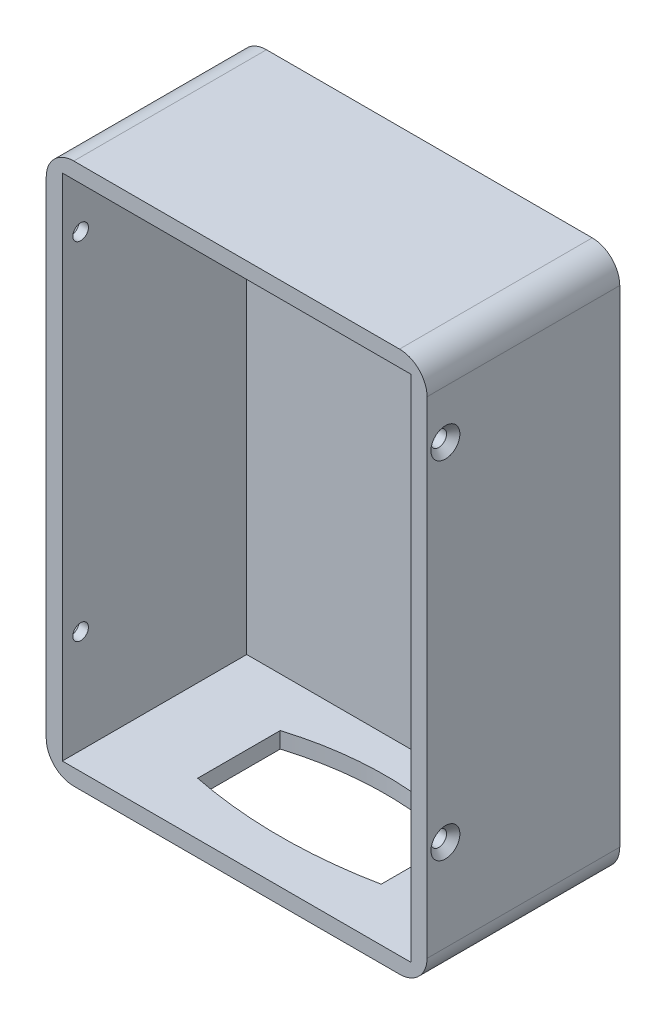
ISO-10303-21;
HEADER;
FILE_DESCRIPTION(('STEP AP214'),'2;1');
FILE_NAME('part.step','',(''),(''),'','','');
FILE_SCHEMA(('AUTOMOTIVE_DESIGN { 1 0 10303 214 1 1 1 1 }'));
ENDSEC;
DATA;
#1=APPLICATION_CONTEXT('core data for automotive mechanical design processes');
#2=APPLICATION_PROTOCOL_DEFINITION('international standard','automotive_design',2000,#1);
#3=PRODUCT_CONTEXT('',#1,'mechanical');
#4=PRODUCT('Part','Part','',(#3));
#5=PRODUCT_RELATED_PRODUCT_CATEGORY('part','',(#4));
#6=PRODUCT_DEFINITION_FORMATION('','',#4);
#7=PRODUCT_DEFINITION_CONTEXT('part definition',#1,'design');
#8=PRODUCT_DEFINITION('design','',#6,#7);
#9=PRODUCT_DEFINITION_SHAPE('','',#8);
#10=(LENGTH_UNIT() NAMED_UNIT(*) SI_UNIT(.MILLI.,.METRE.));
#11=(NAMED_UNIT(*) PLANE_ANGLE_UNIT() SI_UNIT($,.RADIAN.));
#12=(NAMED_UNIT(*) SI_UNIT($,.STERADIAN.) SOLID_ANGLE_UNIT());
#13=UNCERTAINTY_MEASURE_WITH_UNIT(LENGTH_MEASURE(1.E-05),#10,'distance_accuracy_value','');
#14=(GEOMETRIC_REPRESENTATION_CONTEXT(3) GLOBAL_UNCERTAINTY_ASSIGNED_CONTEXT((#13)) GLOBAL_UNIT_ASSIGNED_CONTEXT((#10,
#11,#12)) REPRESENTATION_CONTEXT('',''));
#15=CARTESIAN_POINT('',(0.,0.,0.));
#16=DIRECTION('',(0.,0.,1.));
#17=DIRECTION('',(1.,0.,0.));
#18=AXIS2_PLACEMENT_3D('',#15,#16,#17);
#19=CARTESIAN_POINT('',(41.5,53.,42.));
#20=DIRECTION('',(-1.,0.,0.));
#21=DIRECTION('',(0.,-1.,0.));
#22=AXIS2_PLACEMENT_3D('',#19,#20,#21);
#23=PLANE('',#22);
#24=CARTESIAN_POINT('',(41.5,42.4,38.));
#25=DIRECTION('',(1.,0.,0.));
#26=DIRECTION('',(0.,0.,-1.));
#27=AXIS2_PLACEMENT_3D('',#24,#25,#26);
#28=CIRCLE('',#27,3.15);
#29=CARTESIAN_POINT('',(41.5,42.4,34.85));
#30=VERTEX_POINT('',#29);
#31=EDGE_CURVE('E408',#30,#30,#28,.T.);
#32=ORIENTED_EDGE('',*,*,#31,.F.);
#33=EDGE_LOOP('',(#32));
#34=FACE_BOUND('',#33,.T.);
#35=DIRECTION('',(0.,1.,0.));
#36=VECTOR('',#35,1.);
#37=CARTESIAN_POINT('',(41.5,53.,0.));
#38=LINE('',#37,#36);
#39=CARTESIAN_POINT('',(41.5,-53.,0.));
#40=VERTEX_POINT('',#39);
#41=CARTESIAN_POINT('',(41.5,53.,0.));
#42=VERTEX_POINT('',#41);
#43=EDGE_CURVE('E242',#40,#42,#38,.T.);
#44=ORIENTED_EDGE('',*,*,#43,.T.);
#45=DIRECTION('',(0.,0.,-1.));
#46=VECTOR('',#45,1.);
#47=CARTESIAN_POINT('',(41.5,53.,42.));
#48=LINE('',#47,#46);
#49=CARTESIAN_POINT('',(41.5,53.,42.));
#50=VERTEX_POINT('',#49);
#51=EDGE_CURVE('E262',#50,#42,#48,.T.);
#52=ORIENTED_EDGE('',*,*,#51,.F.);
#53=DIRECTION('',(0.,1.,0.));
#54=VECTOR('',#53,1.);
#55=CARTESIAN_POINT('',(41.5,53.,42.));
#56=LINE('',#55,#54);
#57=CARTESIAN_POINT('',(41.5,-53.,42.));
#58=VERTEX_POINT('',#57);
#59=EDGE_CURVE('E225',#58,#50,#56,.T.);
#60=ORIENTED_EDGE('',*,*,#59,.F.);
#61=DIRECTION('',(0.,0.,-1.));
#62=VECTOR('',#61,1.);
#63=CARTESIAN_POINT('',(41.5,-53.,42.));
#64=LINE('',#63,#62);
#65=EDGE_CURVE('E265',#58,#40,#64,.T.);
#66=ORIENTED_EDGE('',*,*,#65,.T.);
#67=EDGE_LOOP('',(#44,#52,#60,#66));
#68=FACE_BOUND('',#67,.T.);
#69=CARTESIAN_POINT('',(41.5,-33.09,38.));
#70=DIRECTION('',(1.,0.,0.));
#71=DIRECTION('',(0.,0.,-1.));
#72=AXIS2_PLACEMENT_3D('',#69,#70,#71);
#73=CIRCLE('',#72,3.15);
#74=CARTESIAN_POINT('',(41.5,-33.09,34.85));
#75=VERTEX_POINT('',#74);
#76=EDGE_CURVE('E399',#75,#75,#73,.T.);
#77=ORIENTED_EDGE('',*,*,#76,.F.);
#78=EDGE_LOOP('',(#77));
#79=FACE_BOUND('',#78,.T.);
#80=ADVANCED_FACE('F33',(#34,#68,#79),#23,.F.);
#81=CARTESIAN_POINT('',(-35.5,-53.,42.));
#82=DIRECTION('',(0.,0.,1.));
#83=DIRECTION('',(1.,0.,0.));
#84=AXIS2_PLACEMENT_3D('',#81,#82,#83);
#85=PLANE('',#84);
#86=CARTESIAN_POINT('',(-35.5,-53.,42.));
#87=DIRECTION('',(0.,0.,1.));
#88=DIRECTION('',(1.,0.,0.));
#89=AXIS2_PLACEMENT_3D('',#86,#87,#88);
#90=CIRCLE('',#89,6.);
#91=CARTESIAN_POINT('',(-41.5,-53.,42.));
#92=VERTEX_POINT('',#91);
#93=CARTESIAN_POINT('',(-35.5,-59.,42.));
#94=VERTEX_POINT('',#93);
#95=EDGE_CURVE('E217',#92,#94,#90,.T.);
#96=ORIENTED_EDGE('',*,*,#95,.T.);
#97=DIRECTION('',(1.,0.,0.));
#98=VECTOR('',#97,1.);
#99=CARTESIAN_POINT('',(-35.5,-59.,42.));
#100=LINE('',#99,#98);
#101=CARTESIAN_POINT('',(35.5,-59.,42.));
#102=VERTEX_POINT('',#101);
#103=EDGE_CURVE('E220',#94,#102,#100,.T.);
#104=ORIENTED_EDGE('',*,*,#103,.T.);
#105=CARTESIAN_POINT('',(35.5,-53.,42.));
#106=DIRECTION('',(0.,0.,1.));
#107=DIRECTION('',(1.,0.,0.));
#108=AXIS2_PLACEMENT_3D('',#105,#106,#107);
#109=CIRCLE('',#108,6.);
#110=EDGE_CURVE('E223',#102,#58,#109,.T.);
#111=ORIENTED_EDGE('',*,*,#110,.T.);
#112=ORIENTED_EDGE('',*,*,#59,.T.);
#113=CARTESIAN_POINT('',(35.5,53.,42.));
#114=DIRECTION('',(0.,0.,1.));
#115=DIRECTION('',(1.,0.,0.));
#116=AXIS2_PLACEMENT_3D('',#113,#114,#115);
#117=CIRCLE('',#116,6.);
#118=CARTESIAN_POINT('',(35.4999999999999,59.,42.));
#119=VERTEX_POINT('',#118);
#120=EDGE_CURVE('E227',#50,#119,#117,.T.);
#121=ORIENTED_EDGE('',*,*,#120,.T.);
#122=DIRECTION('',(-1.,0.,0.));
#123=VECTOR('',#122,1.);
#124=CARTESIAN_POINT('',(-35.5,59.,42.));
#125=LINE('',#124,#123);
#126=CARTESIAN_POINT('',(-35.5,59.,42.));
#127=VERTEX_POINT('',#126);
#128=EDGE_CURVE('E229',#119,#127,#125,.T.);
#129=ORIENTED_EDGE('',*,*,#128,.T.);
#130=CARTESIAN_POINT('',(-35.5,53.,42.));
#131=DIRECTION('',(0.,0.,1.));
#132=DIRECTION('',(-1.,0.,0.));
#133=AXIS2_PLACEMENT_3D('',#130,#131,#132);
#134=CIRCLE('',#133,6.);
#135=CARTESIAN_POINT('',(-41.5,53.,42.));
#136=VERTEX_POINT('',#135);
#137=EDGE_CURVE('E231',#127,#136,#134,.T.);
#138=ORIENTED_EDGE('',*,*,#137,.T.);
#139=DIRECTION('',(0.,-1.,0.));
#140=VECTOR('',#139,1.);
#141=CARTESIAN_POINT('',(-41.5,53.,42.));
#142=LINE('',#141,#140);
#143=EDGE_CURVE('E233',#136,#92,#142,.T.);
#144=ORIENTED_EDGE('',*,*,#143,.T.);
#145=EDGE_LOOP('',(#96,#104,#111,#112,#121,#129,#138,#144));
#146=FACE_BOUND('',#145,.T.);
#147=DIRECTION('',(-1.,0.,0.));
#148=VECTOR('',#147,1.);
#149=CARTESIAN_POINT('',(-38.,55.5,42.));
#150=LINE('',#149,#148);
#151=CARTESIAN_POINT('',(38.,55.5,42.));
#152=VERTEX_POINT('',#151);
#153=CARTESIAN_POINT('',(-38.,55.5,42.));
#154=VERTEX_POINT('',#153);
#155=EDGE_CURVE('E198',#152,#154,#150,.T.);
#156=ORIENTED_EDGE('',*,*,#155,.F.);
#157=DIRECTION('',(0.,1.,0.));
#158=VECTOR('',#157,1.);
#159=CARTESIAN_POINT('',(38.,55.5,42.));
#160=LINE('',#159,#158);
#161=CARTESIAN_POINT('',(38.,-55.5,42.));
#162=VERTEX_POINT('',#161);
#163=EDGE_CURVE('E196',#162,#152,#160,.T.);
#164=ORIENTED_EDGE('',*,*,#163,.F.);
#165=DIRECTION('',(1.,0.,0.));
#166=VECTOR('',#165,1.);
#167=CARTESIAN_POINT('',(-38.,-55.5,42.));
#168=LINE('',#167,#166);
#169=CARTESIAN_POINT('',(-38.,-55.5,42.));
#170=VERTEX_POINT('',#169);
#171=EDGE_CURVE('E203',#170,#162,#168,.T.);
#172=ORIENTED_EDGE('',*,*,#171,.F.);
#173=DIRECTION('',(0.,-1.,0.));
#174=VECTOR('',#173,1.);
#175=CARTESIAN_POINT('',(-38.,55.5,42.));
#176=LINE('',#175,#174);
#177=EDGE_CURVE('E200',#154,#170,#176,.T.);
#178=ORIENTED_EDGE('',*,*,#177,.F.);
#179=EDGE_LOOP('',(#156,#164,#172,#178));
#180=FACE_BOUND('',#179,.T.);
#181=ADVANCED_FACE('F291',(#146,#180),#85,.T.);
#182=CARTESIAN_POINT('',(-35.5,-53.,0.));
#183=DIRECTION('',(0.,0.,1.));
#184=DIRECTION('',(1.,0.,0.));
#185=AXIS2_PLACEMENT_3D('',#182,#183,#184);
#186=PLANE('',#185);
#187=CARTESIAN_POINT('',(-35.5,-53.,0.));
#188=DIRECTION('',(0.,0.,1.));
#189=DIRECTION('',(1.,0.,0.));
#190=AXIS2_PLACEMENT_3D('',#187,#188,#189);
#191=CIRCLE('',#190,6.);
#192=CARTESIAN_POINT('',(-41.5,-53.,0.));
#193=VERTEX_POINT('',#192);
#194=CARTESIAN_POINT('',(-35.5,-59.,0.));
#195=VERTEX_POINT('',#194);
#196=EDGE_CURVE('E216',#193,#195,#191,.T.);
#197=ORIENTED_EDGE('',*,*,#196,.F.);
#198=DIRECTION('',(0.,-1.,0.));
#199=VECTOR('',#198,1.);
#200=CARTESIAN_POINT('',(-41.5,53.,0.));
#201=LINE('',#200,#199);
#202=CARTESIAN_POINT('',(-41.5,53.,0.));
#203=VERTEX_POINT('',#202);
#204=EDGE_CURVE('E221',#203,#193,#201,.T.);
#205=ORIENTED_EDGE('',*,*,#204,.F.);
#206=CARTESIAN_POINT('',(-35.5,53.,0.));
#207=DIRECTION('',(0.,0.,1.));
#208=DIRECTION('',(-1.,0.,0.));
#209=AXIS2_PLACEMENT_3D('',#206,#207,#208);
#210=CIRCLE('',#209,6.);
#211=CARTESIAN_POINT('',(-35.5,59.,0.));
#212=VERTEX_POINT('',#211);
#213=EDGE_CURVE('E248',#212,#203,#210,.T.);
#214=ORIENTED_EDGE('',*,*,#213,.F.);
#215=DIRECTION('',(-1.,0.,0.));
#216=VECTOR('',#215,1.);
#217=CARTESIAN_POINT('',(-35.5,59.,0.));
#218=LINE('',#217,#216);
#219=CARTESIAN_POINT('',(35.4999999999999,59.,0.));
#220=VERTEX_POINT('',#219);
#221=EDGE_CURVE('E246',#220,#212,#218,.T.);
#222=ORIENTED_EDGE('',*,*,#221,.F.);
#223=CARTESIAN_POINT('',(35.5,53.,0.));
#224=DIRECTION('',(0.,0.,1.));
#225=DIRECTION('',(1.,0.,0.));
#226=AXIS2_PLACEMENT_3D('',#223,#224,#225);
#227=CIRCLE('',#226,6.);
#228=EDGE_CURVE('E244',#42,#220,#227,.T.);
#229=ORIENTED_EDGE('',*,*,#228,.F.);
#230=ORIENTED_EDGE('',*,*,#43,.F.);
#231=CARTESIAN_POINT('',(35.5,-53.,0.));
#232=DIRECTION('',(0.,0.,1.));
#233=DIRECTION('',(1.,0.,0.));
#234=AXIS2_PLACEMENT_3D('',#231,#232,#233);
#235=CIRCLE('',#234,6.);
#236=CARTESIAN_POINT('',(35.5,-59.,0.));
#237=VERTEX_POINT('',#236);
#238=EDGE_CURVE('E240',#237,#40,#235,.T.);
#239=ORIENTED_EDGE('',*,*,#238,.F.);
#240=DIRECTION('',(1.,0.,0.));
#241=VECTOR('',#240,1.);
#242=CARTESIAN_POINT('',(-35.5,-59.,0.));
#243=LINE('',#242,#241);
#244=EDGE_CURVE('E238',#195,#237,#243,.T.);
#245=ORIENTED_EDGE('',*,*,#244,.F.);
#246=EDGE_LOOP('',(#197,#205,#214,#222,#229,#230,#239,#245));
#247=FACE_BOUND('',#246,.T.);
#248=ADVANCED_FACE('F278',(#247),#186,.F.);
#249=CARTESIAN_POINT('',(-35.5,-53.,42.));
#250=DIRECTION('',(0.,0.,-1.));
#251=DIRECTION('',(-1.,0.,0.));
#252=AXIS2_PLACEMENT_3D('',#249,#250,#251);
#253=CYLINDRICAL_SURFACE('',#252,6.);
#254=ORIENTED_EDGE('',*,*,#196,.T.);
#255=DIRECTION('',(0.,0.,-1.));
#256=VECTOR('',#255,1.);
#257=CARTESIAN_POINT('',(-35.5,-59.,42.));
#258=LINE('',#257,#256);
#259=EDGE_CURVE('E11',#94,#195,#258,.T.);
#260=ORIENTED_EDGE('',*,*,#259,.F.);
#261=ORIENTED_EDGE('',*,*,#95,.F.);
#262=DIRECTION('',(0.,0.,-1.));
#263=VECTOR('',#262,1.);
#264=CARTESIAN_POINT('',(-41.5,-53.,42.));
#265=LINE('',#264,#263);
#266=EDGE_CURVE('E235',#92,#193,#265,.T.);
#267=ORIENTED_EDGE('',*,*,#266,.T.);
#268=EDGE_LOOP('',(#254,#260,#261,#267));
#269=FACE_BOUND('',#268,.T.);
#270=ADVANCED_FACE('F35',(#269),#253,.T.);
#271=CARTESIAN_POINT('',(-35.5,-59.,42.));
#272=DIRECTION('',(0.,1.,0.));
#273=DIRECTION('',(0.,0.,1.));
#274=AXIS2_PLACEMENT_3D('',#271,#272,#273);
#275=PLANE('',#274);
#276=DIRECTION('',(0.,0.,1.));
#277=VECTOR('',#276,1.);
#278=CARTESIAN_POINT('',(20.,-59.,0.));
#279=LINE('',#278,#277);
#280=CARTESIAN_POINT('',(20.,-59.,12.5));
#281=VERTEX_POINT('',#280);
#282=CARTESIAN_POINT('',(20.,-59.,30.5));
#283=VERTEX_POINT('',#282);
#284=EDGE_CURVE('E161',#281,#283,#279,.T.);
#285=ORIENTED_EDGE('',*,*,#284,.F.);
#286=CARTESIAN_POINT('',(0.,-59.,77.6666666666665));
#287=DIRECTION('',(0.,-1.,0.));
#288=DIRECTION('',(0.,0.,-1.));
#289=AXIS2_PLACEMENT_3D('',#286,#287,#288);
#290=CIRCLE('',#289,68.1666666666666);
#291=CARTESIAN_POINT('',(-20.,-59.,12.5));
#292=VERTEX_POINT('',#291);
#293=EDGE_CURVE('E178',#292,#281,#290,.T.);
#294=ORIENTED_EDGE('',*,*,#293,.F.);
#295=DIRECTION('',(0.,0.,-1.));
#296=VECTOR('',#295,1.);
#297=CARTESIAN_POINT('',(-20.,-59.,0.));
#298=LINE('',#297,#296);
#299=CARTESIAN_POINT('',(-20.,-59.,30.5));
#300=VERTEX_POINT('',#299);
#301=EDGE_CURVE('E176',#300,#292,#298,.T.);
#302=ORIENTED_EDGE('',*,*,#301,.F.);
#303=CARTESIAN_POINT('',(0.,-59.,-68.5000000000001));
#304=DIRECTION('',(0.,-1.,0.));
#305=DIRECTION('',(0.,0.,-1.));
#306=AXIS2_PLACEMENT_3D('',#303,#304,#305);
#307=CIRCLE('',#306,101.);
#308=EDGE_CURVE('E48',#300,#283,#307,.F.);
#309=ORIENTED_EDGE('',*,*,#308,.T.);
#310=EDGE_LOOP('',(#285,#294,#302,#309));
#311=FACE_BOUND('',#310,.T.);
#312=ORIENTED_EDGE('',*,*,#244,.T.);
#313=DIRECTION('',(0.,0.,-1.));
#314=VECTOR('',#313,1.);
#315=CARTESIAN_POINT('',(35.5,-59.,42.));
#316=LINE('',#315,#314);
#317=EDGE_CURVE('E41',#102,#237,#316,.T.);
#318=ORIENTED_EDGE('',*,*,#317,.F.);
#319=ORIENTED_EDGE('',*,*,#103,.F.);
#320=ORIENTED_EDGE('',*,*,#259,.T.);
#321=EDGE_LOOP('',(#312,#318,#319,#320));
#322=FACE_BOUND('',#321,.T.);
#323=ADVANCED_FACE('F296',(#311,#322),#275,.F.);
#324=CARTESIAN_POINT('',(35.5,-53.,42.));
#325=DIRECTION('',(0.,0.,-1.));
#326=DIRECTION('',(-1.,0.,0.));
#327=AXIS2_PLACEMENT_3D('',#324,#325,#326);
#328=CYLINDRICAL_SURFACE('',#327,6.);
#329=ORIENTED_EDGE('',*,*,#238,.T.);
#330=ORIENTED_EDGE('',*,*,#65,.F.);
#331=ORIENTED_EDGE('',*,*,#110,.F.);
#332=ORIENTED_EDGE('',*,*,#317,.T.);
#333=EDGE_LOOP('',(#329,#330,#331,#332));
#334=FACE_BOUND('',#333,.T.);
#335=ADVANCED_FACE('F272',(#334),#328,.T.);
#336=CARTESIAN_POINT('',(35.5,53.,42.));
#337=DIRECTION('',(0.,0.,-1.));
#338=DIRECTION('',(-1.,0.,0.));
#339=AXIS2_PLACEMENT_3D('',#336,#337,#338);
#340=CYLINDRICAL_SURFACE('',#339,6.);
#341=ORIENTED_EDGE('',*,*,#228,.T.);
#342=DIRECTION('',(0.,0.,-1.));
#343=VECTOR('',#342,1.);
#344=CARTESIAN_POINT('',(35.4999999999999,59.,42.));
#345=LINE('',#344,#343);
#346=EDGE_CURVE('E259',#119,#220,#345,.T.);
#347=ORIENTED_EDGE('',*,*,#346,.F.);
#348=ORIENTED_EDGE('',*,*,#120,.F.);
#349=ORIENTED_EDGE('',*,*,#51,.T.);
#350=EDGE_LOOP('',(#341,#347,#348,#349));
#351=FACE_BOUND('',#350,.T.);
#352=ADVANCED_FACE('F287',(#351),#340,.T.);
#353=CARTESIAN_POINT('',(-35.5,59.,42.));
#354=DIRECTION('',(0.,-1.,0.));
#355=DIRECTION('',(0.,0.,-1.));
#356=AXIS2_PLACEMENT_3D('',#353,#354,#355);
#357=PLANE('',#356);
#358=ORIENTED_EDGE('',*,*,#221,.T.);
#359=DIRECTION('',(0.,0.,-1.));
#360=VECTOR('',#359,1.);
#361=CARTESIAN_POINT('',(-35.5,59.,42.));
#362=LINE('',#361,#360);
#363=EDGE_CURVE('E256',#127,#212,#362,.T.);
#364=ORIENTED_EDGE('',*,*,#363,.F.);
#365=ORIENTED_EDGE('',*,*,#128,.F.);
#366=ORIENTED_EDGE('',*,*,#346,.T.);
#367=EDGE_LOOP('',(#358,#364,#365,#366));
#368=FACE_BOUND('',#367,.T.);
#369=ADVANCED_FACE('F309',(#368),#357,.F.);
#370=CARTESIAN_POINT('',(-35.5,53.,42.));
#371=DIRECTION('',(0.,0.,-1.));
#372=DIRECTION('',(-1.,0.,0.));
#373=AXIS2_PLACEMENT_3D('',#370,#371,#372);
#374=CYLINDRICAL_SURFACE('',#373,6.);
#375=ORIENTED_EDGE('',*,*,#213,.T.);
#376=DIRECTION('',(0.,0.,-1.));
#377=VECTOR('',#376,1.);
#378=CARTESIAN_POINT('',(-41.5,53.,42.));
#379=LINE('',#378,#377);
#380=EDGE_CURVE('E253',#136,#203,#379,.T.);
#381=ORIENTED_EDGE('',*,*,#380,.F.);
#382=ORIENTED_EDGE('',*,*,#137,.F.);
#383=ORIENTED_EDGE('',*,*,#363,.T.);
#384=EDGE_LOOP('',(#375,#381,#382,#383));
#385=FACE_BOUND('',#384,.T.);
#386=ADVANCED_FACE('F307',(#385),#374,.T.);
#387=CARTESIAN_POINT('',(-41.5,53.,42.));
#388=DIRECTION('',(1.,0.,0.));
#389=DIRECTION('',(0.,1.,0.));
#390=AXIS2_PLACEMENT_3D('',#387,#388,#389);
#391=PLANE('',#390);
#392=CARTESIAN_POINT('',(-41.5,-33.09,38.));
#393=DIRECTION('',(-1.,0.,0.));
#394=DIRECTION('',(0.,0.,1.));
#395=AXIS2_PLACEMENT_3D('',#392,#393,#394);
#396=CIRCLE('',#395,3.15);
#397=CARTESIAN_POINT('',(-41.5,-33.09,41.15));
#398=VERTEX_POINT('',#397);
#399=EDGE_CURVE('E381',#398,#398,#396,.T.);
#400=ORIENTED_EDGE('',*,*,#399,.F.);
#401=EDGE_LOOP('',(#400));
#402=FACE_BOUND('',#401,.T.);
#403=CARTESIAN_POINT('',(-41.5,42.4,38.));
#404=DIRECTION('',(-1.,0.,0.));
#405=DIRECTION('',(0.,0.,1.));
#406=AXIS2_PLACEMENT_3D('',#403,#404,#405);
#407=CIRCLE('',#406,3.15);
#408=CARTESIAN_POINT('',(-41.5,42.4,41.15));
#409=VERTEX_POINT('',#408);
#410=EDGE_CURVE('E384',#409,#409,#407,.T.);
#411=ORIENTED_EDGE('',*,*,#410,.F.);
#412=EDGE_LOOP('',(#411));
#413=FACE_BOUND('',#412,.T.);
#414=ORIENTED_EDGE('',*,*,#204,.T.);
#415=ORIENTED_EDGE('',*,*,#266,.F.);
#416=ORIENTED_EDGE('',*,*,#143,.F.);
#417=ORIENTED_EDGE('',*,*,#380,.T.);
#418=EDGE_LOOP('',(#414,#415,#416,#417));
#419=FACE_BOUND('',#418,.T.);
#420=ADVANCED_FACE('F302',(#402,#413,#419),#391,.F.);
#421=CARTESIAN_POINT('',(38.,55.5,42.));
#422=DIRECTION('',(-1.,0.,0.));
#423=DIRECTION('',(0.,-1.,0.));
#424=AXIS2_PLACEMENT_3D('',#421,#422,#423);
#425=PLANE('',#424);
#426=CARTESIAN_POINT('',(38.,-33.09,38.));
#427=DIRECTION('',(-1.,0.,0.));
#428=DIRECTION('',(0.,-1.,0.));
#429=AXIS2_PLACEMENT_3D('',#426,#427,#428);
#430=CIRCLE('',#429,1.7);
#431=CARTESIAN_POINT('',(38.,-34.79,38.));
#432=VERTEX_POINT('',#431);
#433=EDGE_CURVE('E405',#432,#432,#430,.T.);
#434=ORIENTED_EDGE('',*,*,#433,.F.);
#435=EDGE_LOOP('',(#434));
#436=FACE_BOUND('',#435,.T.);
#437=CARTESIAN_POINT('',(38.,42.4,38.));
#438=DIRECTION('',(-1.,0.,0.));
#439=DIRECTION('',(0.,-1.,0.));
#440=AXIS2_PLACEMENT_3D('',#437,#438,#439);
#441=CIRCLE('',#440,1.7);
#442=CARTESIAN_POINT('',(38.,40.7,38.));
#443=VERTEX_POINT('',#442);
#444=EDGE_CURVE('E168',#443,#443,#441,.T.);
#445=ORIENTED_EDGE('',*,*,#444,.F.);
#446=EDGE_LOOP('',(#445));
#447=FACE_BOUND('',#446,.T.);
#448=DIRECTION('',(0.,-1.,0.));
#449=VECTOR('',#448,1.);
#450=CARTESIAN_POINT('',(38.,55.5,1.8));
#451=LINE('',#450,#449);
#452=CARTESIAN_POINT('',(38.,55.5,1.80000000000002));
#453=VERTEX_POINT('',#452);
#454=CARTESIAN_POINT('',(38.,-55.5,1.8));
#455=VERTEX_POINT('',#454);
#456=EDGE_CURVE('E187',#453,#455,#451,.T.);
#457=ORIENTED_EDGE('',*,*,#456,.T.);
#458=DIRECTION('',(0.,0.,-1.));
#459=VECTOR('',#458,1.);
#460=CARTESIAN_POINT('',(38.,-55.5,42.));
#461=LINE('',#460,#459);
#462=EDGE_CURVE('E205',#162,#455,#461,.T.);
#463=ORIENTED_EDGE('',*,*,#462,.F.);
#464=ORIENTED_EDGE('',*,*,#163,.T.);
#465=DIRECTION('',(0.,0.,-1.));
#466=VECTOR('',#465,1.);
#467=CARTESIAN_POINT('',(38.,55.5,42.));
#468=LINE('',#467,#466);
#469=EDGE_CURVE('E213',#152,#453,#468,.T.);
#470=ORIENTED_EDGE('',*,*,#469,.T.);
#471=EDGE_LOOP('',(#457,#463,#464,#470));
#472=FACE_BOUND('',#471,.T.);
#473=ADVANCED_FACE('F367',(#436,#447,#472),#425,.T.);
#474=CARTESIAN_POINT('',(-38.,55.5,42.));
#475=DIRECTION('',(0.,-1.,0.));
#476=DIRECTION('',(0.,0.,-1.));
#477=AXIS2_PLACEMENT_3D('',#474,#475,#476);
#478=PLANE('',#477);
#479=DIRECTION('',(1.,0.,0.));
#480=VECTOR('',#479,1.);
#481=CARTESIAN_POINT('',(-38.,55.5,1.8));
#482=LINE('',#481,#480);
#483=CARTESIAN_POINT('',(-38.,55.5,1.80000000000002));
#484=VERTEX_POINT('',#483);
#485=EDGE_CURVE('E194',#484,#453,#482,.T.);
#486=ORIENTED_EDGE('',*,*,#485,.T.);
#487=ORIENTED_EDGE('',*,*,#469,.F.);
#488=ORIENTED_EDGE('',*,*,#155,.T.);
#489=DIRECTION('',(0.,0.,-1.));
#490=VECTOR('',#489,1.);
#491=CARTESIAN_POINT('',(-38.,55.5,42.));
#492=LINE('',#491,#490);
#493=EDGE_CURVE('E210',#154,#484,#492,.T.);
#494=ORIENTED_EDGE('',*,*,#493,.T.);
#495=EDGE_LOOP('',(#486,#487,#488,#494));
#496=FACE_BOUND('',#495,.T.);
#497=ADVANCED_FACE('F363',(#496),#478,.T.);
#498=CARTESIAN_POINT('',(-38.,55.5,42.));
#499=DIRECTION('',(1.,0.,0.));
#500=DIRECTION('',(0.,1.,0.));
#501=AXIS2_PLACEMENT_3D('',#498,#499,#500);
#502=PLANE('',#501);
#503=CARTESIAN_POINT('',(-38.,-33.09,38.));
#504=DIRECTION('',(1.,0.,0.));
#505=DIRECTION('',(0.,1.,0.));
#506=AXIS2_PLACEMENT_3D('',#503,#504,#505);
#507=CIRCLE('',#506,1.7);
#508=CARTESIAN_POINT('',(-38.,-31.39,38.));
#509=VERTEX_POINT('',#508);
#510=EDGE_CURVE('E387',#509,#509,#507,.T.);
#511=ORIENTED_EDGE('',*,*,#510,.F.);
#512=EDGE_LOOP('',(#511));
#513=FACE_BOUND('',#512,.T.);
#514=CARTESIAN_POINT('',(-38.,42.4,38.));
#515=DIRECTION('',(1.,0.,0.));
#516=DIRECTION('',(0.,1.,0.));
#517=AXIS2_PLACEMENT_3D('',#514,#515,#516);
#518=CIRCLE('',#517,1.7);
#519=CARTESIAN_POINT('',(-38.,44.1,38.));
#520=VERTEX_POINT('',#519);
#521=EDGE_CURVE('E390',#520,#520,#518,.T.);
#522=ORIENTED_EDGE('',*,*,#521,.F.);
#523=EDGE_LOOP('',(#522));
#524=FACE_BOUND('',#523,.T.);
#525=DIRECTION('',(0.,1.,0.));
#526=VECTOR('',#525,1.);
#527=CARTESIAN_POINT('',(-38.,55.5,1.8));
#528=LINE('',#527,#526);
#529=CARTESIAN_POINT('',(-38.,-55.5,1.80000000000002));
#530=VERTEX_POINT('',#529);
#531=EDGE_CURVE('E192',#530,#484,#528,.T.);
#532=ORIENTED_EDGE('',*,*,#531,.T.);
#533=ORIENTED_EDGE('',*,*,#493,.F.);
#534=ORIENTED_EDGE('',*,*,#177,.T.);
#535=DIRECTION('',(0.,0.,-1.));
#536=VECTOR('',#535,1.);
#537=CARTESIAN_POINT('',(-38.,-55.5,42.));
#538=LINE('',#537,#536);
#539=EDGE_CURVE('E207',#170,#530,#538,.T.);
#540=ORIENTED_EDGE('',*,*,#539,.T.);
#541=EDGE_LOOP('',(#532,#533,#534,#540));
#542=FACE_BOUND('',#541,.T.);
#543=ADVANCED_FACE('F360',(#513,#524,#542),#502,.T.);
#544=CARTESIAN_POINT('',(-38.,-55.5,42.));
#545=DIRECTION('',(0.,1.,0.));
#546=DIRECTION('',(0.,0.,1.));
#547=AXIS2_PLACEMENT_3D('',#544,#545,#546);
#548=PLANE('',#547);
#549=CARTESIAN_POINT('',(0.,-55.5,77.6666666666665));
#550=DIRECTION('',(0.,1.,0.));
#551=DIRECTION('',(0.,0.,1.));
#552=AXIS2_PLACEMENT_3D('',#549,#550,#551);
#553=CIRCLE('',#552,68.1666666666666);
#554=CARTESIAN_POINT('',(-20.,-55.5,12.5));
#555=VERTEX_POINT('',#554);
#556=CARTESIAN_POINT('',(20.,-55.5,12.5));
#557=VERTEX_POINT('',#556);
#558=EDGE_CURVE('E167',#555,#557,#553,.F.);
#559=ORIENTED_EDGE('',*,*,#558,.T.);
#560=DIRECTION('',(0.,0.,1.));
#561=VECTOR('',#560,1.);
#562=CARTESIAN_POINT('',(20.,-55.5,0.));
#563=LINE('',#562,#561);
#564=CARTESIAN_POINT('',(20.,-55.5,30.5));
#565=VERTEX_POINT('',#564);
#566=EDGE_CURVE('E155',#557,#565,#563,.T.);
#567=ORIENTED_EDGE('',*,*,#566,.T.);
#568=CARTESIAN_POINT('',(0.,-55.5,-68.5000000000001));
#569=DIRECTION('',(0.,1.,0.));
#570=DIRECTION('',(0.,0.,1.));
#571=AXIS2_PLACEMENT_3D('',#568,#569,#570);
#572=CIRCLE('',#571,101.);
#573=CARTESIAN_POINT('',(-20.,-55.5,30.5));
#574=VERTEX_POINT('',#573);
#575=EDGE_CURVE('E145',#574,#565,#572,.T.);
#576=ORIENTED_EDGE('',*,*,#575,.F.);
#577=DIRECTION('',(0.,0.,-1.));
#578=VECTOR('',#577,1.);
#579=CARTESIAN_POINT('',(-20.,-55.5,0.));
#580=LINE('',#579,#578);
#581=EDGE_CURVE('E154',#574,#555,#580,.T.);
#582=ORIENTED_EDGE('',*,*,#581,.T.);
#583=EDGE_LOOP('',(#559,#567,#576,#582));
#584=FACE_BOUND('',#583,.T.);
#585=DIRECTION('',(-1.,0.,0.));
#586=VECTOR('',#585,1.);
#587=CARTESIAN_POINT('',(-38.,-55.5,1.8));
#588=LINE('',#587,#586);
#589=EDGE_CURVE('E190',#455,#530,#588,.T.);
#590=ORIENTED_EDGE('',*,*,#589,.T.);
#591=ORIENTED_EDGE('',*,*,#539,.F.);
#592=ORIENTED_EDGE('',*,*,#171,.T.);
#593=ORIENTED_EDGE('',*,*,#462,.T.);
#594=EDGE_LOOP('',(#590,#591,#592,#593));
#595=FACE_BOUND('',#594,.T.);
#596=ADVANCED_FACE('F165',(#584,#595),#548,.T.);
#597=CARTESIAN_POINT('',(0.,0.,1.8));
#598=DIRECTION('',(0.,0.,1.));
#599=DIRECTION('',(1.,0.,0.));
#600=AXIS2_PLACEMENT_3D('',#597,#598,#599);
#601=PLANE('',#600);
#602=ORIENTED_EDGE('',*,*,#456,.F.);
#603=ORIENTED_EDGE('',*,*,#485,.F.);
#604=ORIENTED_EDGE('',*,*,#531,.F.);
#605=ORIENTED_EDGE('',*,*,#589,.F.);
#606=EDGE_LOOP('',(#602,#603,#604,#605));
#607=FACE_BOUND('',#606,.T.);
#608=ADVANCED_FACE('F355',(#607),#601,.T.);
#609=CARTESIAN_POINT('',(0.,59.001,77.6666666666665));
#610=DIRECTION('',(0.,-1.,0.));
#611=DIRECTION('',(0.,0.,-1.));
#612=AXIS2_PLACEMENT_3D('',#609,#610,#611);
#613=CYLINDRICAL_SURFACE('',#612,68.1666666666666);
#614=DIRECTION('',(0.,-1.,0.));
#615=VECTOR('',#614,1.);
#616=CARTESIAN_POINT('',(-20.,59.001,12.5));
#617=LINE('',#616,#615);
#618=EDGE_CURVE('E56',#555,#292,#617,.T.);
#619=ORIENTED_EDGE('',*,*,#618,.T.);
#620=ORIENTED_EDGE('',*,*,#293,.T.);
#621=DIRECTION('',(0.,-1.,0.));
#622=VECTOR('',#621,1.);
#623=CARTESIAN_POINT('',(20.,59.001,12.5));
#624=LINE('',#623,#622);
#625=EDGE_CURVE('E162',#557,#281,#624,.T.);
#626=ORIENTED_EDGE('',*,*,#625,.F.);
#627=ORIENTED_EDGE('',*,*,#558,.F.);
#628=EDGE_LOOP('',(#619,#620,#626,#627));
#629=FACE_BOUND('',#628,.T.);
#630=ADVANCED_FACE('F353',(#629),#613,.F.);
#631=CARTESIAN_POINT('',(20.,59.001,0.));
#632=DIRECTION('',(1.,0.,0.));
#633=DIRECTION('',(0.,0.,-1.));
#634=AXIS2_PLACEMENT_3D('',#631,#632,#633);
#635=PLANE('',#634);
#636=ORIENTED_EDGE('',*,*,#625,.T.);
#637=ORIENTED_EDGE('',*,*,#284,.T.);
#638=DIRECTION('',(0.,-1.,0.));
#639=VECTOR('',#638,1.);
#640=CARTESIAN_POINT('',(20.,59.001,30.5));
#641=LINE('',#640,#639);
#642=EDGE_CURVE('E148',#565,#283,#641,.T.);
#643=ORIENTED_EDGE('',*,*,#642,.F.);
#644=ORIENTED_EDGE('',*,*,#566,.F.);
#645=EDGE_LOOP('',(#636,#637,#643,#644));
#646=FACE_BOUND('',#645,.T.);
#647=ADVANCED_FACE('F158',(#646),#635,.F.);
#648=CARTESIAN_POINT('',(0.,59.001,-68.5000000000001));
#649=DIRECTION('',(0.,-1.,0.));
#650=DIRECTION('',(0.,0.,-1.));
#651=AXIS2_PLACEMENT_3D('',#648,#649,#650);
#652=CYLINDRICAL_SURFACE('',#651,101.);
#653=ORIENTED_EDGE('',*,*,#575,.T.);
#654=ORIENTED_EDGE('',*,*,#642,.T.);
#655=ORIENTED_EDGE('',*,*,#308,.F.);
#656=DIRECTION('',(0.,-1.,0.));
#657=VECTOR('',#656,1.);
#658=CARTESIAN_POINT('',(-20.,59.001,30.5));
#659=LINE('',#658,#657);
#660=EDGE_CURVE('E150',#574,#300,#659,.T.);
#661=ORIENTED_EDGE('',*,*,#660,.F.);
#662=EDGE_LOOP('',(#653,#654,#655,#661));
#663=FACE_BOUND('',#662,.T.);
#664=ADVANCED_FACE('F147',(#663),#652,.F.);
#665=CARTESIAN_POINT('',(-20.,59.001,0.));
#666=DIRECTION('',(-1.,0.,0.));
#667=DIRECTION('',(0.,0.,1.));
#668=AXIS2_PLACEMENT_3D('',#665,#666,#667);
#669=PLANE('',#668);
#670=ORIENTED_EDGE('',*,*,#660,.T.);
#671=ORIENTED_EDGE('',*,*,#301,.T.);
#672=ORIENTED_EDGE('',*,*,#618,.F.);
#673=ORIENTED_EDGE('',*,*,#581,.F.);
#674=EDGE_LOOP('',(#670,#671,#672,#673));
#675=FACE_BOUND('',#674,.T.);
#676=ADVANCED_FACE('F339',(#675),#669,.F.);
#677=CARTESIAN_POINT('',(41.5,42.4,38.));
#678=DIRECTION('',(1.,0.,0.));
#679=DIRECTION('',(0.,0.,-1.));
#680=AXIS2_PLACEMENT_3D('',#677,#678,#679);
#681=CYLINDRICAL_SURFACE('',#680,1.7);
#682=CARTESIAN_POINT('',(40.05,42.4,38.));
#683=DIRECTION('',(1.,0.,0.));
#684=DIRECTION('',(0.,0.,-1.));
#685=AXIS2_PLACEMENT_3D('',#682,#683,#684);
#686=CIRCLE('',#685,1.7);
#687=CARTESIAN_POINT('',(40.05,42.4,36.3));
#688=VERTEX_POINT('',#687);
#689=EDGE_CURVE('E171',#688,#688,#686,.T.);
#690=ORIENTED_EDGE('',*,*,#689,.T.);
#691=EDGE_LOOP('',(#690));
#692=FACE_BOUND('',#691,.T.);
#693=ORIENTED_EDGE('',*,*,#444,.T.);
#694=EDGE_LOOP('',(#693));
#695=FACE_BOUND('',#694,.T.);
#696=ADVANCED_FACE('F341',(#692,#695),#681,.F.);
#697=CARTESIAN_POINT('',(41.5,42.4,38.));
#698=DIRECTION('',(1.,0.,0.));
#699=DIRECTION('',(0.,0.,-1.));
#700=AXIS2_PLACEMENT_3D('',#697,#698,#699);
#701=CONICAL_SURFACE('',#700,3.15,0.785398163397448);
#702=ORIENTED_EDGE('',*,*,#689,.F.);
#703=EDGE_LOOP('',(#702));
#704=FACE_BOUND('',#703,.T.);
#705=ORIENTED_EDGE('',*,*,#31,.T.);
#706=EDGE_LOOP('',(#705));
#707=FACE_BOUND('',#706,.T.);
#708=ADVANCED_FACE('F347',(#704,#707),#701,.F.);
#709=CARTESIAN_POINT('',(41.5,-33.09,38.));
#710=DIRECTION('',(1.,0.,0.));
#711=DIRECTION('',(0.,0.,-1.));
#712=AXIS2_PLACEMENT_3D('',#709,#710,#711);
#713=CYLINDRICAL_SURFACE('',#712,1.7);
#714=CARTESIAN_POINT('',(40.05,-33.09,38.));
#715=DIRECTION('',(1.,0.,0.));
#716=DIRECTION('',(0.,0.,-1.));
#717=AXIS2_PLACEMENT_3D('',#714,#715,#716);
#718=CIRCLE('',#717,1.7);
#719=CARTESIAN_POINT('',(40.05,-33.09,36.3));
#720=VERTEX_POINT('',#719);
#721=EDGE_CURVE('E402',#720,#720,#718,.T.);
#722=ORIENTED_EDGE('',*,*,#721,.T.);
#723=EDGE_LOOP('',(#722));
#724=FACE_BOUND('',#723,.T.);
#725=ORIENTED_EDGE('',*,*,#433,.T.);
#726=EDGE_LOOP('',(#725));
#727=FACE_BOUND('',#726,.T.);
#728=ADVANCED_FACE('F416',(#724,#727),#713,.F.);
#729=CARTESIAN_POINT('',(41.5,-33.09,38.));
#730=DIRECTION('',(1.,0.,0.));
#731=DIRECTION('',(0.,0.,-1.));
#732=AXIS2_PLACEMENT_3D('',#729,#730,#731);
#733=CONICAL_SURFACE('',#732,3.15,0.785398163397448);
#734=ORIENTED_EDGE('',*,*,#721,.F.);
#735=EDGE_LOOP('',(#734));
#736=FACE_BOUND('',#735,.T.);
#737=ORIENTED_EDGE('',*,*,#76,.T.);
#738=EDGE_LOOP('',(#737));
#739=FACE_BOUND('',#738,.T.);
#740=ADVANCED_FACE('F421',(#736,#739),#733,.F.);
#741=CARTESIAN_POINT('',(-41.5,42.4,38.));
#742=DIRECTION('',(-1.,0.,0.));
#743=DIRECTION('',(0.,0.,1.));
#744=AXIS2_PLACEMENT_3D('',#741,#742,#743);
#745=CYLINDRICAL_SURFACE('',#744,1.7);
#746=CARTESIAN_POINT('',(-40.05,42.4,38.));
#747=DIRECTION('',(-1.,0.,0.));
#748=DIRECTION('',(0.,0.,1.));
#749=AXIS2_PLACEMENT_3D('',#746,#747,#748);
#750=CIRCLE('',#749,1.7);
#751=CARTESIAN_POINT('',(-40.05,42.4,39.7));
#752=VERTEX_POINT('',#751);
#753=EDGE_CURVE('E386',#752,#752,#750,.T.);
#754=ORIENTED_EDGE('',*,*,#753,.T.);
#755=EDGE_LOOP('',(#754));
#756=FACE_BOUND('',#755,.T.);
#757=ORIENTED_EDGE('',*,*,#521,.T.);
#758=EDGE_LOOP('',(#757));
#759=FACE_BOUND('',#758,.T.);
#760=ADVANCED_FACE('F550',(#756,#759),#745,.F.);
#761=CARTESIAN_POINT('',(-41.5,42.4,38.));
#762=DIRECTION('',(-1.,0.,0.));
#763=DIRECTION('',(0.,0.,1.));
#764=AXIS2_PLACEMENT_3D('',#761,#762,#763);
#765=CONICAL_SURFACE('',#764,3.15,0.785398163397448);
#766=ORIENTED_EDGE('',*,*,#753,.F.);
#767=EDGE_LOOP('',(#766));
#768=FACE_BOUND('',#767,.T.);
#769=ORIENTED_EDGE('',*,*,#410,.T.);
#770=EDGE_LOOP('',(#769));
#771=FACE_BOUND('',#770,.T.);
#772=ADVANCED_FACE('F557',(#768,#771),#765,.F.);
#773=CARTESIAN_POINT('',(-41.5,-33.09,38.));
#774=DIRECTION('',(-1.,0.,0.));
#775=DIRECTION('',(0.,0.,1.));
#776=AXIS2_PLACEMENT_3D('',#773,#774,#775);
#777=CYLINDRICAL_SURFACE('',#776,1.7);
#778=CARTESIAN_POINT('',(-40.05,-33.09,38.));
#779=DIRECTION('',(-1.,0.,0.));
#780=DIRECTION('',(0.,0.,1.));
#781=AXIS2_PLACEMENT_3D('',#778,#779,#780);
#782=CIRCLE('',#781,1.7);
#783=CARTESIAN_POINT('',(-40.05,-33.09,39.7));
#784=VERTEX_POINT('',#783);
#785=EDGE_CURVE('E393',#784,#784,#782,.T.);
#786=ORIENTED_EDGE('',*,*,#785,.T.);
#787=EDGE_LOOP('',(#786));
#788=FACE_BOUND('',#787,.T.);
#789=ORIENTED_EDGE('',*,*,#510,.T.);
#790=EDGE_LOOP('',(#789));
#791=FACE_BOUND('',#790,.T.);
#792=ADVANCED_FACE('F566',(#788,#791),#777,.F.);
#793=CARTESIAN_POINT('',(-41.5,-33.09,38.));
#794=DIRECTION('',(-1.,0.,0.));
#795=DIRECTION('',(0.,0.,1.));
#796=AXIS2_PLACEMENT_3D('',#793,#794,#795);
#797=CONICAL_SURFACE('',#796,3.15,0.785398163397448);
#798=ORIENTED_EDGE('',*,*,#785,.F.);
#799=EDGE_LOOP('',(#798));
#800=FACE_BOUND('',#799,.T.);
#801=ORIENTED_EDGE('',*,*,#399,.T.);
#802=EDGE_LOOP('',(#801));
#803=FACE_BOUND('',#802,.T.);
#804=ADVANCED_FACE('F575',(#800,#803),#797,.F.);
#805=CLOSED_SHELL('',(#80,#181,#248,#270,#323,#335,#352,#369,#386,#420,#473,#497,#543,#596,#608,
#630,#647,#664,#676,#696,#708,#728,#740,#760,#772,#792,#804));
#806=MANIFOLD_SOLID_BREP('B2',#805);
#807=ADVANCED_BREP_SHAPE_REPRESENTATION('',(#18,#806),#14);
#808=SHAPE_DEFINITION_REPRESENTATION(#9,#807);
ENDSEC;
END-ISO-10303-21;
